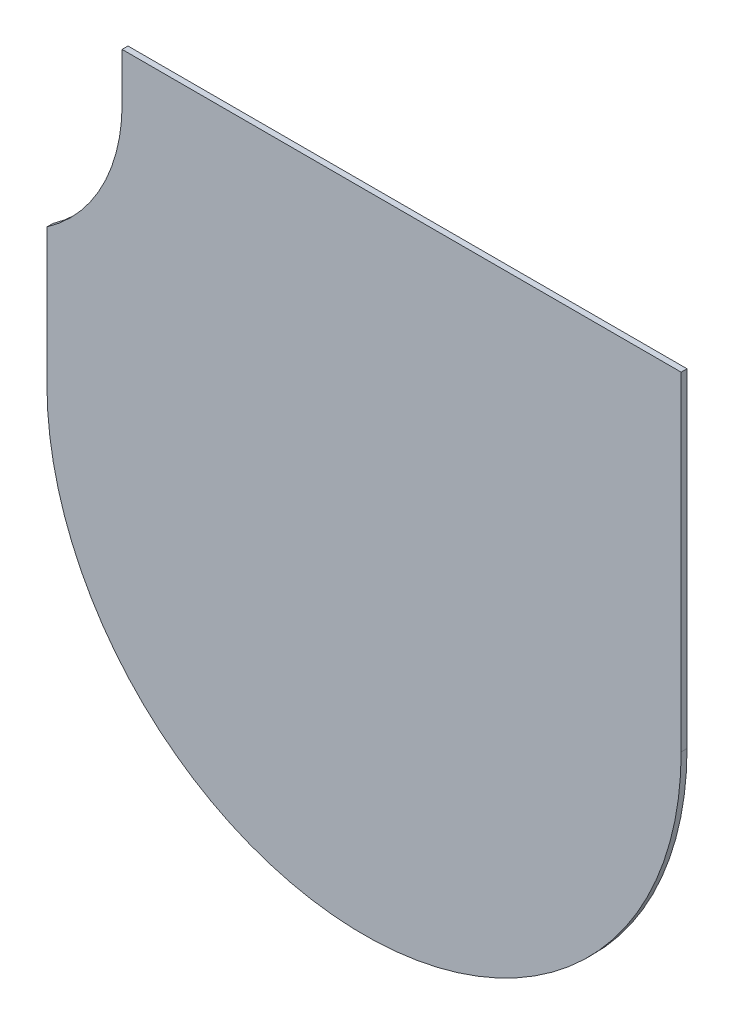
ISO-10303-21;
HEADER;
FILE_DESCRIPTION(('STEP AP214'),'2;1');
FILE_NAME('part.step','',(''),(''),'','','');
FILE_SCHEMA(('AUTOMOTIVE_DESIGN { 1 0 10303 214 1 1 1 1 }'));
ENDSEC;
DATA;
#1=APPLICATION_CONTEXT('core data for automotive mechanical design processes');
#2=APPLICATION_PROTOCOL_DEFINITION('international standard','automotive_design',2000,#1);
#3=PRODUCT_CONTEXT('',#1,'mechanical');
#4=PRODUCT('Part','Part','',(#3));
#5=PRODUCT_RELATED_PRODUCT_CATEGORY('part','',(#4));
#6=PRODUCT_DEFINITION_FORMATION('','',#4);
#7=PRODUCT_DEFINITION_CONTEXT('part definition',#1,'design');
#8=PRODUCT_DEFINITION('design','',#6,#7);
#9=PRODUCT_DEFINITION_SHAPE('','',#8);
#10=(LENGTH_UNIT() NAMED_UNIT(*) SI_UNIT(.MILLI.,.METRE.));
#11=(NAMED_UNIT(*) PLANE_ANGLE_UNIT() SI_UNIT($,.RADIAN.));
#12=(NAMED_UNIT(*) SI_UNIT($,.STERADIAN.) SOLID_ANGLE_UNIT());
#13=UNCERTAINTY_MEASURE_WITH_UNIT(LENGTH_MEASURE(1.E-05),#10,'distance_accuracy_value','');
#14=(GEOMETRIC_REPRESENTATION_CONTEXT(3) GLOBAL_UNCERTAINTY_ASSIGNED_CONTEXT((#13)) GLOBAL_UNIT_ASSIGNED_CONTEXT((#10,
#11,#12)) REPRESENTATION_CONTEXT('',''));
#15=CARTESIAN_POINT('',(0.,0.,0.));
#16=DIRECTION('',(0.,0.,1.));
#17=DIRECTION('',(1.,0.,0.));
#18=AXIS2_PLACEMENT_3D('',#15,#16,#17);
#19=CARTESIAN_POINT('',(47.625,0.,1.5875));
#20=DIRECTION('',(1.,0.,0.));
#21=DIRECTION('',(0.,0.,-1.));
#22=AXIS2_PLACEMENT_3D('',#19,#20,#21);
#23=PLANE('',#22);
#24=DIRECTION('',(0.,-1.,0.));
#25=VECTOR('',#24,1.);
#26=CARTESIAN_POINT('',(47.625,0.,0.));
#27=LINE('',#26,#25);
#28=CARTESIAN_POINT('',(47.625,12.7,0.));
#29=VERTEX_POINT('',#28);
#30=CARTESIAN_POINT('',(47.625,0.,0.));
#31=VERTEX_POINT('',#30);
#32=EDGE_CURVE('E132',#29,#31,#27,.T.);
#33=ORIENTED_EDGE('',*,*,#32,.T.);
#34=DIRECTION('',(0.,0.,-1.));
#35=VECTOR('',#34,1.);
#36=CARTESIAN_POINT('',(47.625,0.,1.5875));
#37=LINE('',#36,#35);
#38=CARTESIAN_POINT('',(47.625,0.,1.5875));
#39=VERTEX_POINT('',#38);
#40=EDGE_CURVE('E11',#39,#31,#37,.T.);
#41=ORIENTED_EDGE('',*,*,#40,.F.);
#42=DIRECTION('',(0.,-1.,0.));
#43=VECTOR('',#42,1.);
#44=CARTESIAN_POINT('',(47.625,0.,1.5875));
#45=LINE('',#44,#43);
#46=CARTESIAN_POINT('',(47.625,12.7,1.5875));
#47=VERTEX_POINT('',#46);
#48=EDGE_CURVE('E133',#47,#39,#45,.T.);
#49=ORIENTED_EDGE('',*,*,#48,.F.);
#50=DIRECTION('',(0.,0.,-1.));
#51=VECTOR('',#50,1.);
#52=CARTESIAN_POINT('',(47.625,12.7,1.5875));
#53=LINE('',#52,#51);
#54=EDGE_CURVE('E48',#47,#29,#53,.T.);
#55=ORIENTED_EDGE('',*,*,#54,.T.);
#56=EDGE_LOOP('',(#33,#41,#49,#55));
#57=FACE_BOUND('',#56,.T.);
#58=ADVANCED_FACE('F40',(#57),#23,.F.);
#59=CARTESIAN_POINT('',(0.,0.,1.5875));
#60=DIRECTION('',(0.,0.,-1.));
#61=DIRECTION('',(-1.,0.,0.));
#62=AXIS2_PLACEMENT_3D('',#59,#60,#61);
#63=CYLINDRICAL_SURFACE('',#62,47.625);
#64=CARTESIAN_POINT('',(0.,0.,0.));
#65=DIRECTION('',(0.,0.,-1.));
#66=DIRECTION('',(1.,0.,0.));
#67=AXIS2_PLACEMENT_3D('',#64,#65,#66);
#68=CIRCLE('',#67,47.625);
#69=CARTESIAN_POINT('',(27.305,-39.0202203991725,0.));
#70=VERTEX_POINT('',#69);
#71=EDGE_CURVE('E68',#31,#70,#68,.T.);
#72=ORIENTED_EDGE('',*,*,#71,.T.);
#73=DIRECTION('',(0.,0.,-1.));
#74=VECTOR('',#73,1.);
#75=CARTESIAN_POINT('',(27.305,-39.0202203991725,1.5875));
#76=LINE('',#75,#74);
#77=CARTESIAN_POINT('',(27.305,-39.0202203991725,1.5875));
#78=VERTEX_POINT('',#77);
#79=EDGE_CURVE('E114',#78,#70,#76,.T.);
#80=ORIENTED_EDGE('',*,*,#79,.F.);
#81=CARTESIAN_POINT('',(0.,0.,1.5875));
#82=DIRECTION('',(0.,0.,-1.));
#83=DIRECTION('',(1.,0.,0.));
#84=AXIS2_PLACEMENT_3D('',#81,#82,#83);
#85=CIRCLE('',#84,47.625);
#86=EDGE_CURVE('E95',#39,#78,#85,.T.);
#87=ORIENTED_EDGE('',*,*,#86,.F.);
#88=ORIENTED_EDGE('',*,*,#40,.T.);
#89=EDGE_LOOP('',(#72,#80,#87,#88));
#90=FACE_BOUND('',#89,.T.);
#91=ADVANCED_FACE('F156',(#90),#63,.F.);
#92=CARTESIAN_POINT('',(186.055,12.7,1.5875));
#93=DIRECTION('',(0.,-1.,0.));
#94=DIRECTION('',(1.,0.,0.));
#95=AXIS2_PLACEMENT_3D('',#92,#93,#94);
#96=PLANE('',#95);
#97=DIRECTION('',(-1.,0.,0.));
#98=VECTOR('',#97,1.);
#99=CARTESIAN_POINT('',(186.055,12.7,0.));
#100=LINE('',#99,#98);
#101=CARTESIAN_POINT('',(198.755,12.7,0.));
#102=VERTEX_POINT('',#101);
#103=EDGE_CURVE('E90',#102,#29,#100,.T.);
#104=ORIENTED_EDGE('',*,*,#103,.T.);
#105=ORIENTED_EDGE('',*,*,#54,.F.);
#106=DIRECTION('',(-1.,0.,0.));
#107=VECTOR('',#106,1.);
#108=CARTESIAN_POINT('',(186.055,12.7,1.5875));
#109=LINE('',#108,#107);
#110=CARTESIAN_POINT('',(198.755,12.7,1.5875));
#111=VERTEX_POINT('',#110);
#112=EDGE_CURVE('E56',#111,#47,#109,.T.);
#113=ORIENTED_EDGE('',*,*,#112,.F.);
#114=DIRECTION('',(0.,0.,-1.));
#115=VECTOR('',#114,1.);
#116=CARTESIAN_POINT('',(198.755,12.7,1.5875));
#117=LINE('',#116,#115);
#118=EDGE_CURVE('E122',#111,#102,#117,.T.);
#119=ORIENTED_EDGE('',*,*,#118,.T.);
#120=EDGE_LOOP('',(#104,#105,#113,#119));
#121=FACE_BOUND('',#120,.T.);
#122=ADVANCED_FACE('F152',(#121),#96,.F.);
#123=CARTESIAN_POINT('',(113.03,-76.2,1.5875));
#124=DIRECTION('',(0.,0.,1.));
#125=DIRECTION('',(1.,0.,0.));
#126=AXIS2_PLACEMENT_3D('',#123,#124,#125);
#127=PLANE('',#126);
#128=ORIENTED_EDGE('',*,*,#48,.T.);
#129=ORIENTED_EDGE('',*,*,#86,.T.);
#130=DIRECTION('',(0.,-1.,0.));
#131=VECTOR('',#130,1.);
#132=CARTESIAN_POINT('',(27.305,-39.0202203991725,1.5875));
#133=LINE('',#132,#131);
#134=CARTESIAN_POINT('',(27.305,-76.2,1.5875));
#135=VERTEX_POINT('',#134);
#136=EDGE_CURVE('E98',#78,#135,#133,.T.);
#137=ORIENTED_EDGE('',*,*,#136,.T.);
#138=CARTESIAN_POINT('',(113.03,-76.2,1.5875));
#139=DIRECTION('',(0.,0.,1.));
#140=DIRECTION('',(1.,0.,0.));
#141=AXIS2_PLACEMENT_3D('',#138,#139,#140);
#142=CIRCLE('',#141,85.725);
#143=CARTESIAN_POINT('',(198.755,-76.2,1.5875));
#144=VERTEX_POINT('',#143);
#145=EDGE_CURVE('E102',#135,#144,#142,.T.);
#146=ORIENTED_EDGE('',*,*,#145,.T.);
#147=DIRECTION('',(0.,1.,0.));
#148=VECTOR('',#147,1.);
#149=CARTESIAN_POINT('',(198.755,12.7,1.5875));
#150=LINE('',#149,#148);
#151=EDGE_CURVE('E120',#144,#111,#150,.T.);
#152=ORIENTED_EDGE('',*,*,#151,.T.);
#153=ORIENTED_EDGE('',*,*,#112,.T.);
#154=EDGE_LOOP('',(#128,#129,#137,#146,#152,#153));
#155=FACE_BOUND('',#154,.T.);
#156=ADVANCED_FACE('F100',(#155),#127,.T.);
#157=CARTESIAN_POINT('',(113.03,-76.2,0.));
#158=DIRECTION('',(0.,0.,1.));
#159=DIRECTION('',(1.,0.,0.));
#160=AXIS2_PLACEMENT_3D('',#157,#158,#159);
#161=PLANE('',#160);
#162=ORIENTED_EDGE('',*,*,#32,.F.);
#163=ORIENTED_EDGE('',*,*,#103,.F.);
#164=DIRECTION('',(0.,1.,0.));
#165=VECTOR('',#164,1.);
#166=CARTESIAN_POINT('',(198.755,12.7,0.));
#167=LINE('',#166,#165);
#168=CARTESIAN_POINT('',(198.755,-76.2,0.));
#169=VERTEX_POINT('',#168);
#170=EDGE_CURVE('E106',#169,#102,#167,.T.);
#171=ORIENTED_EDGE('',*,*,#170,.F.);
#172=CARTESIAN_POINT('',(113.03,-76.2,0.));
#173=DIRECTION('',(0.,0.,1.));
#174=DIRECTION('',(1.,0.,0.));
#175=AXIS2_PLACEMENT_3D('',#172,#173,#174);
#176=CIRCLE('',#175,85.725);
#177=CARTESIAN_POINT('',(27.305,-76.2,0.));
#178=VERTEX_POINT('',#177);
#179=EDGE_CURVE('E126',#178,#169,#176,.T.);
#180=ORIENTED_EDGE('',*,*,#179,.F.);
#181=DIRECTION('',(0.,-1.,0.));
#182=VECTOR('',#181,1.);
#183=CARTESIAN_POINT('',(27.305,-39.0202203991725,0.));
#184=LINE('',#183,#182);
#185=EDGE_CURVE('E111',#70,#178,#184,.T.);
#186=ORIENTED_EDGE('',*,*,#185,.F.);
#187=ORIENTED_EDGE('',*,*,#71,.F.);
#188=EDGE_LOOP('',(#162,#163,#171,#180,#186,#187));
#189=FACE_BOUND('',#188,.T.);
#190=ADVANCED_FACE('F144',(#189),#161,.F.);
#191=CARTESIAN_POINT('',(27.305,-39.0202203991725,1.5875));
#192=DIRECTION('',(1.,0.,0.));
#193=DIRECTION('',(0.,1.,0.));
#194=AXIS2_PLACEMENT_3D('',#191,#192,#193);
#195=PLANE('',#194);
#196=ORIENTED_EDGE('',*,*,#185,.T.);
#197=DIRECTION('',(0.,0.,-1.));
#198=VECTOR('',#197,1.);
#199=CARTESIAN_POINT('',(27.305,-76.2,1.5875));
#200=LINE('',#199,#198);
#201=EDGE_CURVE('E109',#135,#178,#200,.T.);
#202=ORIENTED_EDGE('',*,*,#201,.F.);
#203=ORIENTED_EDGE('',*,*,#136,.F.);
#204=ORIENTED_EDGE('',*,*,#79,.T.);
#205=EDGE_LOOP('',(#196,#202,#203,#204));
#206=FACE_BOUND('',#205,.T.);
#207=ADVANCED_FACE('F110',(#206),#195,.F.);
#208=CARTESIAN_POINT('',(113.03,-76.2,1.5875));
#209=DIRECTION('',(0.,0.,-1.));
#210=DIRECTION('',(-1.,0.,0.));
#211=AXIS2_PLACEMENT_3D('',#208,#209,#210);
#212=CYLINDRICAL_SURFACE('',#211,85.725);
#213=ORIENTED_EDGE('',*,*,#179,.T.);
#214=DIRECTION('',(0.,0.,-1.));
#215=VECTOR('',#214,1.);
#216=CARTESIAN_POINT('',(198.755,-76.2,1.5875));
#217=LINE('',#216,#215);
#218=EDGE_CURVE('E115',#144,#169,#217,.T.);
#219=ORIENTED_EDGE('',*,*,#218,.F.);
#220=ORIENTED_EDGE('',*,*,#145,.F.);
#221=ORIENTED_EDGE('',*,*,#201,.T.);
#222=EDGE_LOOP('',(#213,#219,#220,#221));
#223=FACE_BOUND('',#222,.T.);
#224=ADVANCED_FACE('F117',(#223),#212,.T.);
#225=CARTESIAN_POINT('',(198.755,12.7,1.5875));
#226=DIRECTION('',(-1.,0.,0.));
#227=DIRECTION('',(0.,0.,1.));
#228=AXIS2_PLACEMENT_3D('',#225,#226,#227);
#229=PLANE('',#228);
#230=ORIENTED_EDGE('',*,*,#170,.T.);
#231=ORIENTED_EDGE('',*,*,#118,.F.);
#232=ORIENTED_EDGE('',*,*,#151,.F.);
#233=ORIENTED_EDGE('',*,*,#218,.T.);
#234=EDGE_LOOP('',(#230,#231,#232,#233));
#235=FACE_BOUND('',#234,.T.);
#236=ADVANCED_FACE('F165',(#235),#229,.F.);
#237=CLOSED_SHELL('',(#58,#91,#122,#156,#190,#207,#224,#236));
#238=MANIFOLD_SOLID_BREP('B2',#237);
#239=ADVANCED_BREP_SHAPE_REPRESENTATION('',(#18,#238),#14);
#240=SHAPE_DEFINITION_REPRESENTATION(#9,#239);
ENDSEC;
END-ISO-10303-21;
